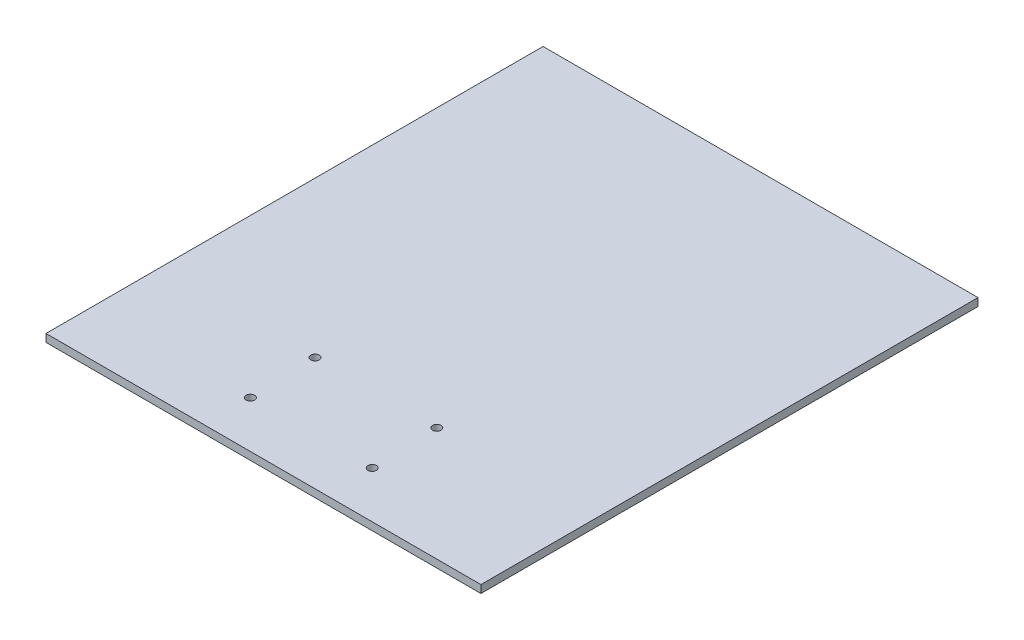
ISO-10303-21;
HEADER;
FILE_DESCRIPTION(('STEP AP214'),'2;1');
FILE_NAME('part.step','',(''),(''),'','','');
FILE_SCHEMA(('AUTOMOTIVE_DESIGN { 1 0 10303 214 1 1 1 1 }'));
ENDSEC;
DATA;
#1=APPLICATION_CONTEXT('core data for automotive mechanical design processes');
#2=APPLICATION_PROTOCOL_DEFINITION('international standard','automotive_design',2000,#1);
#3=PRODUCT_CONTEXT('',#1,'mechanical');
#4=PRODUCT('Part','Part','',(#3));
#5=PRODUCT_RELATED_PRODUCT_CATEGORY('part','',(#4));
#6=PRODUCT_DEFINITION_FORMATION('','',#4);
#7=PRODUCT_DEFINITION_CONTEXT('part definition',#1,'design');
#8=PRODUCT_DEFINITION('design','',#6,#7);
#9=PRODUCT_DEFINITION_SHAPE('','',#8);
#10=(LENGTH_UNIT() NAMED_UNIT(*) SI_UNIT(.MILLI.,.METRE.));
#11=(NAMED_UNIT(*) PLANE_ANGLE_UNIT() SI_UNIT($,.RADIAN.));
#12=(NAMED_UNIT(*) SI_UNIT($,.STERADIAN.) SOLID_ANGLE_UNIT());
#13=UNCERTAINTY_MEASURE_WITH_UNIT(LENGTH_MEASURE(1.E-05),#10,'distance_accuracy_value','');
#14=(GEOMETRIC_REPRESENTATION_CONTEXT(3) GLOBAL_UNCERTAINTY_ASSIGNED_CONTEXT((#13)) GLOBAL_UNIT_ASSIGNED_CONTEXT((#10,
#11,#12)) REPRESENTATION_CONTEXT('',''));
#15=CARTESIAN_POINT('',(0.,0.,0.));
#16=DIRECTION('',(0.,0.,1.));
#17=DIRECTION('',(1.,0.,0.));
#18=AXIS2_PLACEMENT_3D('',#15,#16,#17);
#19=CARTESIAN_POINT('',(0.,3.175,0.));
#20=DIRECTION('',(-1.,0.,0.));
#21=DIRECTION('',(0.,0.,1.));
#22=AXIS2_PLACEMENT_3D('',#19,#20,#21);
#23=PLANE('',#22);
#24=DIRECTION('',(0.,0.,-1.));
#25=VECTOR('',#24,1.);
#26=CARTESIAN_POINT('',(0.,0.,0.));
#27=LINE('',#26,#25);
#28=CARTESIAN_POINT('',(0.,0.,203.2));
#29=VERTEX_POINT('',#28);
#30=CARTESIAN_POINT('',(0.,0.,0.));
#31=VERTEX_POINT('',#30);
#32=EDGE_CURVE('E98',#29,#31,#27,.T.);
#33=ORIENTED_EDGE('',*,*,#32,.T.);
#34=DIRECTION('',(0.,-1.,0.));
#35=VECTOR('',#34,1.);
#36=CARTESIAN_POINT('',(0.,3.175,0.));
#37=LINE('',#36,#35);
#38=CARTESIAN_POINT('',(0.,3.175,0.));
#39=VERTEX_POINT('',#38);
#40=EDGE_CURVE('E11',#39,#31,#37,.T.);
#41=ORIENTED_EDGE('',*,*,#40,.F.);
#42=DIRECTION('',(0.,0.,-1.));
#43=VECTOR('',#42,1.);
#44=CARTESIAN_POINT('',(0.,3.175,0.));
#45=LINE('',#44,#43);
#46=CARTESIAN_POINT('',(0.,3.175,203.2));
#47=VERTEX_POINT('',#46);
#48=EDGE_CURVE('E86',#47,#39,#45,.T.);
#49=ORIENTED_EDGE('',*,*,#48,.F.);
#50=DIRECTION('',(0.,-1.,0.));
#51=VECTOR('',#50,1.);
#52=CARTESIAN_POINT('',(0.,3.175,203.2));
#53=LINE('',#52,#51);
#54=EDGE_CURVE('E94',#47,#29,#53,.T.);
#55=ORIENTED_EDGE('',*,*,#54,.T.);
#56=EDGE_LOOP('',(#33,#41,#49,#55));
#57=FACE_BOUND('',#56,.T.);
#58=ADVANCED_FACE('F35',(#57),#23,.F.);
#59=CARTESIAN_POINT('',(0.,3.175,0.));
#60=DIRECTION('',(0.,0.,1.));
#61=DIRECTION('',(1.,0.,0.));
#62=AXIS2_PLACEMENT_3D('',#59,#60,#61);
#63=PLANE('',#62);
#64=DIRECTION('',(-1.,0.,0.));
#65=VECTOR('',#64,1.);
#66=CARTESIAN_POINT('',(0.,0.,0.));
#67=LINE('',#66,#65);
#68=CARTESIAN_POINT('',(-177.8,0.,0.));
#69=VERTEX_POINT('',#68);
#70=EDGE_CURVE('E90',#31,#69,#67,.T.);
#71=ORIENTED_EDGE('',*,*,#70,.T.);
#72=DIRECTION('',(0.,-1.,0.));
#73=VECTOR('',#72,1.);
#74=CARTESIAN_POINT('',(-177.8,3.175,0.));
#75=LINE('',#74,#73);
#76=CARTESIAN_POINT('',(-177.8,3.175,0.));
#77=VERTEX_POINT('',#76);
#78=EDGE_CURVE('E43',#77,#69,#75,.T.);
#79=ORIENTED_EDGE('',*,*,#78,.F.);
#80=DIRECTION('',(-1.,0.,0.));
#81=VECTOR('',#80,1.);
#82=CARTESIAN_POINT('',(0.,3.175,0.));
#83=LINE('',#82,#81);
#84=EDGE_CURVE('E81',#39,#77,#83,.T.);
#85=ORIENTED_EDGE('',*,*,#84,.F.);
#86=ORIENTED_EDGE('',*,*,#40,.T.);
#87=EDGE_LOOP('',(#71,#79,#85,#86));
#88=FACE_BOUND('',#87,.T.);
#89=ADVANCED_FACE('F89',(#88),#63,.F.);
#90=CARTESIAN_POINT('',(-177.8,3.175,0.));
#91=DIRECTION('',(1.,0.,0.));
#92=DIRECTION('',(0.,0.,-1.));
#93=AXIS2_PLACEMENT_3D('',#90,#91,#92);
#94=PLANE('',#93);
#95=DIRECTION('',(0.,0.,1.));
#96=VECTOR('',#95,1.);
#97=CARTESIAN_POINT('',(-177.8,0.,0.));
#98=LINE('',#97,#96);
#99=CARTESIAN_POINT('',(-177.8,0.,203.2));
#100=VERTEX_POINT('',#99);
#101=EDGE_CURVE('E68',#69,#100,#98,.T.);
#102=ORIENTED_EDGE('',*,*,#101,.T.);
#103=DIRECTION('',(0.,-1.,0.));
#104=VECTOR('',#103,1.);
#105=CARTESIAN_POINT('',(-177.8,3.175,203.2));
#106=LINE('',#105,#104);
#107=CARTESIAN_POINT('',(-177.8,3.175,203.2));
#108=VERTEX_POINT('',#107);
#109=EDGE_CURVE('E91',#108,#100,#106,.T.);
#110=ORIENTED_EDGE('',*,*,#109,.F.);
#111=DIRECTION('',(0.,0.,1.));
#112=VECTOR('',#111,1.);
#113=CARTESIAN_POINT('',(-177.8,3.175,0.));
#114=LINE('',#113,#112);
#115=EDGE_CURVE('E84',#77,#108,#114,.T.);
#116=ORIENTED_EDGE('',*,*,#115,.F.);
#117=ORIENTED_EDGE('',*,*,#78,.T.);
#118=EDGE_LOOP('',(#102,#110,#116,#117));
#119=FACE_BOUND('',#118,.T.);
#120=ADVANCED_FACE('F92',(#119),#94,.F.);
#121=CARTESIAN_POINT('',(0.,3.175,203.2));
#122=DIRECTION('',(0.,0.,-1.));
#123=DIRECTION('',(-1.,0.,0.));
#124=AXIS2_PLACEMENT_3D('',#121,#122,#123);
#125=PLANE('',#124);
#126=DIRECTION('',(1.,0.,0.));
#127=VECTOR('',#126,1.);
#128=CARTESIAN_POINT('',(0.,0.,203.2));
#129=LINE('',#128,#127);
#130=EDGE_CURVE('E74',#100,#29,#129,.T.);
#131=ORIENTED_EDGE('',*,*,#130,.T.);
#132=ORIENTED_EDGE('',*,*,#54,.F.);
#133=DIRECTION('',(1.,0.,0.));
#134=VECTOR('',#133,1.);
#135=CARTESIAN_POINT('',(0.,3.175,203.2));
#136=LINE('',#135,#134);
#137=EDGE_CURVE('E51',#108,#47,#136,.T.);
#138=ORIENTED_EDGE('',*,*,#137,.F.);
#139=ORIENTED_EDGE('',*,*,#109,.T.);
#140=EDGE_LOOP('',(#131,#132,#138,#139));
#141=FACE_BOUND('',#140,.T.);
#142=ADVANCED_FACE('F106',(#141),#125,.F.);
#143=CARTESIAN_POINT('',(0.,3.175,0.));
#144=DIRECTION('',(0.,-1.,0.));
#145=DIRECTION('',(0.,0.,-1.));
#146=AXIS2_PLACEMENT_3D('',#143,#144,#145);
#147=PLANE('',#146);
#148=CARTESIAN_POINT('',(-114.299999999999,3.175,156.727119999999));
#149=DIRECTION('',(0.,1.,0.));
#150=DIRECTION('',(0.,0.,1.));
#151=AXIS2_PLACEMENT_3D('',#148,#149,#150);
#152=CIRCLE('',#151,1.72719999999998);
#153=CARTESIAN_POINT('',(-114.299999999999,3.175,158.454319999999));
#154=VERTEX_POINT('',#153);
#155=EDGE_CURVE('E132',#154,#154,#152,.T.);
#156=ORIENTED_EDGE('',*,*,#155,.F.);
#157=EDGE_LOOP('',(#156));
#158=FACE_BOUND('',#157,.T.);
#159=CARTESIAN_POINT('',(-64.511593904691,3.175,156.727119999999));
#160=DIRECTION('',(0.,1.,0.));
#161=DIRECTION('',(0.,0.,1.));
#162=AXIS2_PLACEMENT_3D('',#159,#160,#161);
#163=CIRCLE('',#162,1.72719999999998);
#164=CARTESIAN_POINT('',(-64.511593904691,3.175,158.454319999999));
#165=VERTEX_POINT('',#164);
#166=EDGE_CURVE('E126',#165,#165,#163,.T.);
#167=ORIENTED_EDGE('',*,*,#166,.F.);
#168=EDGE_LOOP('',(#167));
#169=FACE_BOUND('',#168,.T.);
#170=CARTESIAN_POINT('',(-113.288406095308,3.175,184.15));
#171=DIRECTION('',(0.,1.,0.));
#172=DIRECTION('',(0.,0.,1.));
#173=AXIS2_PLACEMENT_3D('',#170,#171,#172);
#174=CIRCLE('',#173,1.72719999999998);
#175=CARTESIAN_POINT('',(-113.288406095308,3.175,185.8772));
#176=VERTEX_POINT('',#175);
#177=EDGE_CURVE('E120',#176,#176,#174,.T.);
#178=ORIENTED_EDGE('',*,*,#177,.F.);
#179=EDGE_LOOP('',(#178));
#180=FACE_BOUND('',#179,.T.);
#181=CARTESIAN_POINT('',(-63.4999999999999,3.175,184.15));
#182=DIRECTION('',(0.,1.,0.));
#183=DIRECTION('',(0.,0.,1.));
#184=AXIS2_PLACEMENT_3D('',#181,#182,#183);
#185=CIRCLE('',#184,1.72719999999998);
#186=CARTESIAN_POINT('',(-63.4999999999999,3.175,185.8772));
#187=VERTEX_POINT('',#186);
#188=EDGE_CURVE('E114',#187,#187,#185,.T.);
#189=ORIENTED_EDGE('',*,*,#188,.F.);
#190=EDGE_LOOP('',(#189));
#191=FACE_BOUND('',#190,.T.);
#192=ORIENTED_EDGE('',*,*,#48,.T.);
#193=ORIENTED_EDGE('',*,*,#84,.T.);
#194=ORIENTED_EDGE('',*,*,#115,.T.);
#195=ORIENTED_EDGE('',*,*,#137,.T.);
#196=EDGE_LOOP('',(#192,#193,#194,#195));
#197=FACE_BOUND('',#196,.T.);
#198=ADVANCED_FACE('F82',(#158,#169,#180,#191,#197),#147,.F.);
#199=CARTESIAN_POINT('',(0.,0.,0.));
#200=DIRECTION('',(0.,-1.,0.));
#201=DIRECTION('',(0.,0.,-1.));
#202=AXIS2_PLACEMENT_3D('',#199,#200,#201);
#203=PLANE('',#202);
#204=CARTESIAN_POINT('',(-114.299999999999,0.,156.727119999999));
#205=DIRECTION('',(0.,-1.,0.));
#206=DIRECTION('',(0.,0.,-1.));
#207=AXIS2_PLACEMENT_3D('',#204,#205,#206);
#208=CIRCLE('',#207,1.72719999999999);
#209=CARTESIAN_POINT('',(-114.299999999999,0.,154.999919999999));
#210=VERTEX_POINT('',#209);
#211=EDGE_CURVE('E129',#210,#210,#208,.T.);
#212=ORIENTED_EDGE('',*,*,#211,.F.);
#213=EDGE_LOOP('',(#212));
#214=FACE_BOUND('',#213,.T.);
#215=CARTESIAN_POINT('',(-64.511593904691,0.,156.727119999999));
#216=DIRECTION('',(0.,-1.,0.));
#217=DIRECTION('',(0.,0.,-1.));
#218=AXIS2_PLACEMENT_3D('',#215,#216,#217);
#219=CIRCLE('',#218,1.72719999999999);
#220=CARTESIAN_POINT('',(-64.511593904691,0.,154.999919999999));
#221=VERTEX_POINT('',#220);
#222=EDGE_CURVE('E123',#221,#221,#219,.T.);
#223=ORIENTED_EDGE('',*,*,#222,.F.);
#224=EDGE_LOOP('',(#223));
#225=FACE_BOUND('',#224,.T.);
#226=CARTESIAN_POINT('',(-113.288406095308,0.,184.15));
#227=DIRECTION('',(0.,-1.,0.));
#228=DIRECTION('',(0.,0.,-1.));
#229=AXIS2_PLACEMENT_3D('',#226,#227,#228);
#230=CIRCLE('',#229,1.72719999999999);
#231=CARTESIAN_POINT('',(-113.288406095308,0.,182.4228));
#232=VERTEX_POINT('',#231);
#233=EDGE_CURVE('E117',#232,#232,#230,.T.);
#234=ORIENTED_EDGE('',*,*,#233,.F.);
#235=EDGE_LOOP('',(#234));
#236=FACE_BOUND('',#235,.T.);
#237=CARTESIAN_POINT('',(-63.4999999999999,0.,184.15));
#238=DIRECTION('',(0.,-1.,0.));
#239=DIRECTION('',(0.,0.,-1.));
#240=AXIS2_PLACEMENT_3D('',#237,#238,#239);
#241=CIRCLE('',#240,1.72719999999999);
#242=CARTESIAN_POINT('',(-63.4999999999999,0.,182.4228));
#243=VERTEX_POINT('',#242);
#244=EDGE_CURVE('E101',#243,#243,#241,.T.);
#245=ORIENTED_EDGE('',*,*,#244,.F.);
#246=EDGE_LOOP('',(#245));
#247=FACE_BOUND('',#246,.T.);
#248=ORIENTED_EDGE('',*,*,#32,.F.);
#249=ORIENTED_EDGE('',*,*,#130,.F.);
#250=ORIENTED_EDGE('',*,*,#101,.F.);
#251=ORIENTED_EDGE('',*,*,#70,.F.);
#252=EDGE_LOOP('',(#248,#249,#250,#251));
#253=FACE_BOUND('',#252,.T.);
#254=ADVANCED_FACE('F109',(#214,#225,#236,#247,#253),#203,.T.);
#255=CARTESIAN_POINT('',(-63.4999999999999,3.175,184.15));
#256=DIRECTION('',(0.,1.,0.));
#257=DIRECTION('',(0.,0.,1.));
#258=AXIS2_PLACEMENT_3D('',#255,#256,#257);
#259=CYLINDRICAL_SURFACE('',#258,1.72719999999999);
#260=ORIENTED_EDGE('',*,*,#188,.T.);
#261=EDGE_LOOP('',(#260));
#262=FACE_BOUND('',#261,.T.);
#263=ORIENTED_EDGE('',*,*,#244,.T.);
#264=EDGE_LOOP('',(#263));
#265=FACE_BOUND('',#264,.T.);
#266=ADVANCED_FACE('F148',(#262,#265),#259,.F.);
#267=CARTESIAN_POINT('',(-113.288406095308,3.175,184.15));
#268=DIRECTION('',(0.,1.,0.));
#269=DIRECTION('',(0.,0.,1.));
#270=AXIS2_PLACEMENT_3D('',#267,#268,#269);
#271=CYLINDRICAL_SURFACE('',#270,1.72719999999999);
#272=ORIENTED_EDGE('',*,*,#177,.T.);
#273=EDGE_LOOP('',(#272));
#274=FACE_BOUND('',#273,.T.);
#275=ORIENTED_EDGE('',*,*,#233,.T.);
#276=EDGE_LOOP('',(#275));
#277=FACE_BOUND('',#276,.T.);
#278=ADVANCED_FACE('F151',(#274,#277),#271,.F.);
#279=CARTESIAN_POINT('',(-64.511593904691,3.175,156.727119999999));
#280=DIRECTION('',(0.,1.,0.));
#281=DIRECTION('',(0.,0.,1.));
#282=AXIS2_PLACEMENT_3D('',#279,#280,#281);
#283=CYLINDRICAL_SURFACE('',#282,1.72719999999999);
#284=ORIENTED_EDGE('',*,*,#166,.T.);
#285=EDGE_LOOP('',(#284));
#286=FACE_BOUND('',#285,.T.);
#287=ORIENTED_EDGE('',*,*,#222,.T.);
#288=EDGE_LOOP('',(#287));
#289=FACE_BOUND('',#288,.T.);
#290=ADVANCED_FACE('F199',(#286,#289),#283,.F.);
#291=CARTESIAN_POINT('',(-114.299999999999,3.175,156.727119999999));
#292=DIRECTION('',(0.,1.,0.));
#293=DIRECTION('',(0.,0.,1.));
#294=AXIS2_PLACEMENT_3D('',#291,#292,#293);
#295=CYLINDRICAL_SURFACE('',#294,1.72719999999999);
#296=ORIENTED_EDGE('',*,*,#155,.T.);
#297=EDGE_LOOP('',(#296));
#298=FACE_BOUND('',#297,.T.);
#299=ORIENTED_EDGE('',*,*,#211,.T.);
#300=EDGE_LOOP('',(#299));
#301=FACE_BOUND('',#300,.T.);
#302=ADVANCED_FACE('F136',(#298,#301),#295,.F.);
#303=CLOSED_SHELL('',(#58,#89,#120,#142,#198,#254,#266,#278,#290,#302));
#304=MANIFOLD_SOLID_BREP('B2',#303);
#305=ADVANCED_BREP_SHAPE_REPRESENTATION('',(#18,#304),#14);
#306=SHAPE_DEFINITION_REPRESENTATION(#9,#305);
ENDSEC;
END-ISO-10303-21;
